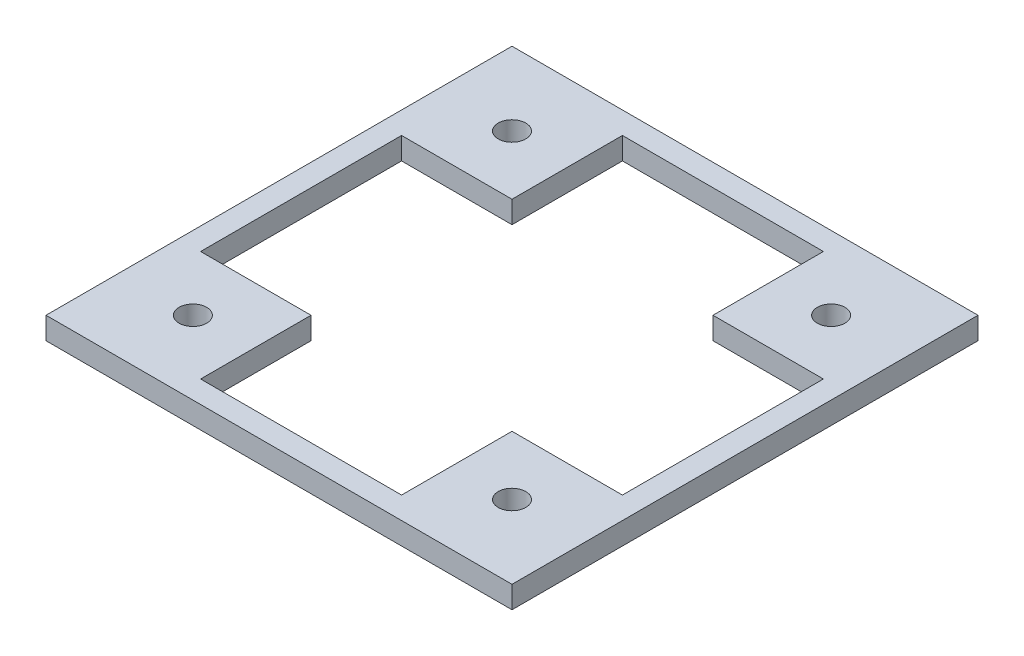
ISO-10303-21;
HEADER;
FILE_DESCRIPTION(('STEP AP214'),'2;1');
FILE_NAME('part.step','',(''),(''),'','','');
FILE_SCHEMA(('AUTOMOTIVE_DESIGN { 1 0 10303 214 1 1 1 1 }'));
ENDSEC;
DATA;
#1=APPLICATION_CONTEXT('core data for automotive mechanical design processes');
#2=APPLICATION_PROTOCOL_DEFINITION('international standard','automotive_design',2000,#1);
#3=PRODUCT_CONTEXT('',#1,'mechanical');
#4=PRODUCT('Part','Part','',(#3));
#5=PRODUCT_RELATED_PRODUCT_CATEGORY('part','',(#4));
#6=PRODUCT_DEFINITION_FORMATION('','',#4);
#7=PRODUCT_DEFINITION_CONTEXT('part definition',#1,'design');
#8=PRODUCT_DEFINITION('design','',#6,#7);
#9=PRODUCT_DEFINITION_SHAPE('','',#8);
#10=(LENGTH_UNIT() NAMED_UNIT(*) SI_UNIT(.MILLI.,.METRE.));
#11=(NAMED_UNIT(*) PLANE_ANGLE_UNIT() SI_UNIT($,.RADIAN.));
#12=(NAMED_UNIT(*) SI_UNIT($,.STERADIAN.) SOLID_ANGLE_UNIT());
#13=UNCERTAINTY_MEASURE_WITH_UNIT(LENGTH_MEASURE(1.E-05),#10,'distance_accuracy_value','');
#14=(GEOMETRIC_REPRESENTATION_CONTEXT(3) GLOBAL_UNCERTAINTY_ASSIGNED_CONTEXT((#13)) GLOBAL_UNIT_ASSIGNED_CONTEXT((#10,
#11,#12)) REPRESENTATION_CONTEXT('',''));
#15=CARTESIAN_POINT('',(0.,0.,0.));
#16=DIRECTION('',(0.,0.,1.));
#17=DIRECTION('',(1.,0.,0.));
#18=AXIS2_PLACEMENT_3D('',#15,#16,#17);
#19=CARTESIAN_POINT('',(-41.925626342507,2.,0.));
#20=DIRECTION('',(1.,0.,0.));
#21=DIRECTION('',(0.,0.,-1.));
#22=AXIS2_PLACEMENT_3D('',#19,#20,#21);
#23=PLANE('',#22);
#24=DIRECTION('',(0.,0.,1.));
#25=VECTOR('',#24,1.);
#26=CARTESIAN_POINT('',(-41.925626342507,0.,0.));
#27=LINE('',#26,#25);
#28=CARTESIAN_POINT('',(-41.925626342507,0.,-55.0108557996784));
#29=VERTEX_POINT('',#28);
#30=CARTESIAN_POINT('',(-41.925626342507,0.,-12.8108557996784));
#31=VERTEX_POINT('',#30);
#32=EDGE_CURVE('E219',#29,#31,#27,.T.);
#33=ORIENTED_EDGE('',*,*,#32,.F.);
#34=DIRECTION('',(0.,-1.,0.));
#35=VECTOR('',#34,1.);
#36=CARTESIAN_POINT('',(-41.925626342507,2.,-55.0108557996784));
#37=LINE('',#36,#35);
#38=CARTESIAN_POINT('',(-41.925626342507,2.,-55.0108557996784));
#39=VERTEX_POINT('',#38);
#40=EDGE_CURVE('E11',#39,#29,#37,.T.);
#41=ORIENTED_EDGE('',*,*,#40,.F.);
#42=DIRECTION('',(0.,0.,1.));
#43=VECTOR('',#42,1.);
#44=CARTESIAN_POINT('',(-41.925626342507,2.,0.));
#45=LINE('',#44,#43);
#46=CARTESIAN_POINT('',(-41.925626342507,2.,-12.8108557996784));
#47=VERTEX_POINT('',#46);
#48=EDGE_CURVE('E177',#39,#47,#45,.T.);
#49=ORIENTED_EDGE('',*,*,#48,.T.);
#50=DIRECTION('',(0.,-1.,0.));
#51=VECTOR('',#50,1.);
#52=CARTESIAN_POINT('',(-41.925626342507,2.,-12.8108557996784));
#53=LINE('',#52,#51);
#54=EDGE_CURVE('E115',#47,#31,#53,.T.);
#55=ORIENTED_EDGE('',*,*,#54,.T.);
#56=EDGE_LOOP('',(#33,#41,#49,#55));
#57=FACE_BOUND('',#56,.T.);
#58=ADVANCED_FACE('F37',(#57),#23,.T.);
#59=CARTESIAN_POINT('',(0.,2.,-55.0108557996784));
#60=DIRECTION('',(0.,0.,-1.));
#61=DIRECTION('',(-1.,0.,0.));
#62=AXIS2_PLACEMENT_3D('',#59,#60,#61);
#63=PLANE('',#62);
#64=DIRECTION('',(1.,0.,0.));
#65=VECTOR('',#64,1.);
#66=CARTESIAN_POINT('',(0.,0.,-55.0108557996784));
#67=LINE('',#66,#65);
#68=CARTESIAN_POINT('',(-84.125626342507,0.,-55.0108557996784));
#69=VERTEX_POINT('',#68);
#70=EDGE_CURVE('E167',#69,#29,#67,.T.);
#71=ORIENTED_EDGE('',*,*,#70,.F.);
#72=DIRECTION('',(0.,-1.,0.));
#73=VECTOR('',#72,1.);
#74=CARTESIAN_POINT('',(-84.125626342507,2.,-55.0108557996784));
#75=LINE('',#74,#73);
#76=CARTESIAN_POINT('',(-84.125626342507,2.,-55.0108557996784));
#77=VERTEX_POINT('',#76);
#78=EDGE_CURVE('E47',#77,#69,#75,.T.);
#79=ORIENTED_EDGE('',*,*,#78,.F.);
#80=DIRECTION('',(1.,0.,0.));
#81=VECTOR('',#80,1.);
#82=CARTESIAN_POINT('',(0.,2.,-55.0108557996784));
#83=LINE('',#82,#81);
#84=EDGE_CURVE('E165',#77,#39,#83,.T.);
#85=ORIENTED_EDGE('',*,*,#84,.T.);
#86=ORIENTED_EDGE('',*,*,#40,.T.);
#87=EDGE_LOOP('',(#71,#79,#85,#86));
#88=FACE_BOUND('',#87,.T.);
#89=ADVANCED_FACE('F163',(#88),#63,.T.);
#90=CARTESIAN_POINT('',(-84.125626342507,2.,0.));
#91=DIRECTION('',(1.,0.,0.));
#92=DIRECTION('',(0.,0.,-1.));
#93=AXIS2_PLACEMENT_3D('',#90,#91,#92);
#94=PLANE('',#93);
#95=DIRECTION('',(0.,0.,1.));
#96=VECTOR('',#95,1.);
#97=CARTESIAN_POINT('',(-84.125626342507,0.,0.));
#98=LINE('',#97,#96);
#99=CARTESIAN_POINT('',(-84.125626342507,0.,-12.8108557996784));
#100=VERTEX_POINT('',#99);
#101=EDGE_CURVE('E222',#69,#100,#98,.T.);
#102=ORIENTED_EDGE('',*,*,#101,.T.);
#103=DIRECTION('',(0.,-1.,0.));
#104=VECTOR('',#103,1.);
#105=CARTESIAN_POINT('',(-84.125626342507,2.,-12.8108557996784));
#106=LINE('',#105,#104);
#107=CARTESIAN_POINT('',(-84.125626342507,2.,-12.8108557996784));
#108=VERTEX_POINT('',#107);
#109=EDGE_CURVE('E170',#108,#100,#106,.T.);
#110=ORIENTED_EDGE('',*,*,#109,.F.);
#111=DIRECTION('',(0.,0.,1.));
#112=VECTOR('',#111,1.);
#113=CARTESIAN_POINT('',(-84.125626342507,2.,0.));
#114=LINE('',#113,#112);
#115=EDGE_CURVE('E173',#77,#108,#114,.T.);
#116=ORIENTED_EDGE('',*,*,#115,.F.);
#117=ORIENTED_EDGE('',*,*,#78,.T.);
#118=EDGE_LOOP('',(#102,#110,#116,#117));
#119=FACE_BOUND('',#118,.T.);
#120=ADVANCED_FACE('F174',(#119),#94,.F.);
#121=CARTESIAN_POINT('',(-72.125626342507,2.,0.));
#122=DIRECTION('',(1.,0.,0.));
#123=DIRECTION('',(0.,0.,-1.));
#124=AXIS2_PLACEMENT_3D('',#121,#122,#123);
#125=PLANE('',#124);
#126=DIRECTION('',(0.,0.,1.));
#127=VECTOR('',#126,1.);
#128=CARTESIAN_POINT('',(-72.125626342507,0.,0.));
#129=LINE('',#128,#127);
#130=CARTESIAN_POINT('',(-72.125626342507,0.,-53.0108557996784));
#131=VERTEX_POINT('',#130);
#132=CARTESIAN_POINT('',(-72.125626342507,0.,-43.0108557996784));
#133=VERTEX_POINT('',#132);
#134=EDGE_CURVE('E185',#131,#133,#129,.T.);
#135=ORIENTED_EDGE('',*,*,#134,.F.);
#136=DIRECTION('',(0.,-1.,0.));
#137=VECTOR('',#136,1.);
#138=CARTESIAN_POINT('',(-72.125626342507,2.,-53.0108557996784));
#139=LINE('',#138,#137);
#140=CARTESIAN_POINT('',(-72.125626342507,2.,-53.0108557996784));
#141=VERTEX_POINT('',#140);
#142=EDGE_CURVE('E41',#141,#131,#139,.T.);
#143=ORIENTED_EDGE('',*,*,#142,.F.);
#144=DIRECTION('',(0.,0.,1.));
#145=VECTOR('',#144,1.);
#146=CARTESIAN_POINT('',(-72.125626342507,2.,0.));
#147=LINE('',#146,#145);
#148=CARTESIAN_POINT('',(-72.125626342507,2.,-43.0108557996784));
#149=VERTEX_POINT('',#148);
#150=EDGE_CURVE('E225',#141,#149,#147,.T.);
#151=ORIENTED_EDGE('',*,*,#150,.T.);
#152=DIRECTION('',(0.,-1.,0.));
#153=VECTOR('',#152,1.);
#154=CARTESIAN_POINT('',(-72.125626342507,2.,-43.0108557996784));
#155=LINE('',#154,#153);
#156=EDGE_CURVE('E184',#149,#133,#155,.T.);
#157=ORIENTED_EDGE('',*,*,#156,.T.);
#158=EDGE_LOOP('',(#135,#143,#151,#157));
#159=FACE_BOUND('',#158,.T.);
#160=ADVANCED_FACE('F39',(#159),#125,.T.);
#161=CARTESIAN_POINT('',(0.,2.,-53.0108557996784));
#162=DIRECTION('',(0.,0.,-1.));
#163=DIRECTION('',(-1.,0.,0.));
#164=AXIS2_PLACEMENT_3D('',#161,#162,#163);
#165=PLANE('',#164);
#166=DIRECTION('',(1.,0.,0.));
#167=VECTOR('',#166,1.);
#168=CARTESIAN_POINT('',(0.,0.,-53.0108557996784));
#169=LINE('',#168,#167);
#170=CARTESIAN_POINT('',(-53.925626342507,0.,-53.0108557996784));
#171=VERTEX_POINT('',#170);
#172=EDGE_CURVE('E188',#131,#171,#169,.T.);
#173=ORIENTED_EDGE('',*,*,#172,.T.);
#174=DIRECTION('',(0.,-1.,0.));
#175=VECTOR('',#174,1.);
#176=CARTESIAN_POINT('',(-53.925626342507,2.,-53.0108557996784));
#177=LINE('',#176,#175);
#178=CARTESIAN_POINT('',(-53.925626342507,2.,-53.0108557996784));
#179=VERTEX_POINT('',#178);
#180=EDGE_CURVE('E248',#179,#171,#177,.T.);
#181=ORIENTED_EDGE('',*,*,#180,.F.);
#182=DIRECTION('',(1.,0.,0.));
#183=VECTOR('',#182,1.);
#184=CARTESIAN_POINT('',(0.,2.,-53.0108557996784));
#185=LINE('',#184,#183);
#186=EDGE_CURVE('E257',#141,#179,#185,.T.);
#187=ORIENTED_EDGE('',*,*,#186,.F.);
#188=ORIENTED_EDGE('',*,*,#142,.T.);
#189=EDGE_LOOP('',(#173,#181,#187,#188));
#190=FACE_BOUND('',#189,.T.);
#191=ADVANCED_FACE('F256',(#190),#165,.F.);
#192=CARTESIAN_POINT('',(-53.925626342507,2.,0.));
#193=DIRECTION('',(1.,0.,0.));
#194=DIRECTION('',(0.,0.,-1.));
#195=AXIS2_PLACEMENT_3D('',#192,#193,#194);
#196=PLANE('',#195);
#197=DIRECTION('',(0.,0.,1.));
#198=VECTOR('',#197,1.);
#199=CARTESIAN_POINT('',(-53.925626342507,0.,0.));
#200=LINE('',#199,#198);
#201=CARTESIAN_POINT('',(-53.925626342507,0.,-43.0108557996785));
#202=VERTEX_POINT('',#201);
#203=EDGE_CURVE('E191',#171,#202,#200,.T.);
#204=ORIENTED_EDGE('',*,*,#203,.T.);
#205=DIRECTION('',(0.,-1.,0.));
#206=VECTOR('',#205,1.);
#207=CARTESIAN_POINT('',(-53.925626342507,2.,-43.0108557996785));
#208=LINE('',#207,#206);
#209=CARTESIAN_POINT('',(-53.925626342507,2.,-43.0108557996785));
#210=VERTEX_POINT('',#209);
#211=EDGE_CURVE('E246',#210,#202,#208,.T.);
#212=ORIENTED_EDGE('',*,*,#211,.F.);
#213=DIRECTION('',(0.,0.,1.));
#214=VECTOR('',#213,1.);
#215=CARTESIAN_POINT('',(-53.925626342507,2.,0.));
#216=LINE('',#215,#214);
#217=EDGE_CURVE('E313',#179,#210,#216,.T.);
#218=ORIENTED_EDGE('',*,*,#217,.F.);
#219=ORIENTED_EDGE('',*,*,#180,.T.);
#220=EDGE_LOOP('',(#204,#212,#218,#219));
#221=FACE_BOUND('',#220,.T.);
#222=ADVANCED_FACE('F312',(#221),#196,.F.);
#223=CARTESIAN_POINT('',(0.,2.,-43.0108557996785));
#224=DIRECTION('',(0.,0.,-1.));
#225=DIRECTION('',(-1.,0.,0.));
#226=AXIS2_PLACEMENT_3D('',#223,#224,#225);
#227=PLANE('',#226);
#228=DIRECTION('',(1.,0.,0.));
#229=VECTOR('',#228,1.);
#230=CARTESIAN_POINT('',(0.,0.,-43.0108557996785));
#231=LINE('',#230,#229);
#232=CARTESIAN_POINT('',(-43.925626342507,0.,-43.0108557996785));
#233=VERTEX_POINT('',#232);
#234=EDGE_CURVE('E193',#202,#233,#231,.T.);
#235=ORIENTED_EDGE('',*,*,#234,.T.);
#236=DIRECTION('',(0.,-1.,0.));
#237=VECTOR('',#236,1.);
#238=CARTESIAN_POINT('',(-43.925626342507,2.,-43.0108557996785));
#239=LINE('',#238,#237);
#240=CARTESIAN_POINT('',(-43.925626342507,2.,-43.0108557996785));
#241=VERTEX_POINT('',#240);
#242=EDGE_CURVE('E243',#241,#233,#239,.T.);
#243=ORIENTED_EDGE('',*,*,#242,.F.);
#244=DIRECTION('',(1.,0.,0.));
#245=VECTOR('',#244,1.);
#246=CARTESIAN_POINT('',(0.,2.,-43.0108557996785));
#247=LINE('',#246,#245);
#248=EDGE_CURVE('E311',#210,#241,#247,.T.);
#249=ORIENTED_EDGE('',*,*,#248,.F.);
#250=ORIENTED_EDGE('',*,*,#211,.T.);
#251=EDGE_LOOP('',(#235,#243,#249,#250));
#252=FACE_BOUND('',#251,.T.);
#253=ADVANCED_FACE('F308',(#252),#227,.F.);
#254=CARTESIAN_POINT('',(-43.925626342507,2.,0.));
#255=DIRECTION('',(1.,0.,0.));
#256=DIRECTION('',(0.,0.,-1.));
#257=AXIS2_PLACEMENT_3D('',#254,#255,#256);
#258=PLANE('',#257);
#259=DIRECTION('',(0.,0.,1.));
#260=VECTOR('',#259,1.);
#261=CARTESIAN_POINT('',(-43.925626342507,0.,0.));
#262=LINE('',#261,#260);
#263=CARTESIAN_POINT('',(-43.925626342507,0.,-24.8108557996784));
#264=VERTEX_POINT('',#263);
#265=EDGE_CURVE('E195',#233,#264,#262,.T.);
#266=ORIENTED_EDGE('',*,*,#265,.T.);
#267=DIRECTION('',(0.,-1.,0.));
#268=VECTOR('',#267,1.);
#269=CARTESIAN_POINT('',(-43.925626342507,2.,-24.8108557996784));
#270=LINE('',#269,#268);
#271=CARTESIAN_POINT('',(-43.925626342507,2.,-24.8108557996784));
#272=VERTEX_POINT('',#271);
#273=EDGE_CURVE('E241',#272,#264,#270,.T.);
#274=ORIENTED_EDGE('',*,*,#273,.F.);
#275=DIRECTION('',(0.,0.,1.));
#276=VECTOR('',#275,1.);
#277=CARTESIAN_POINT('',(-43.925626342507,2.,0.));
#278=LINE('',#277,#276);
#279=EDGE_CURVE('E316',#241,#272,#278,.T.);
#280=ORIENTED_EDGE('',*,*,#279,.F.);
#281=ORIENTED_EDGE('',*,*,#242,.T.);
#282=EDGE_LOOP('',(#266,#274,#280,#281));
#283=FACE_BOUND('',#282,.T.);
#284=ADVANCED_FACE('F305',(#283),#258,.F.);
#285=CARTESIAN_POINT('',(0.,2.,-24.8108557996784));
#286=DIRECTION('',(0.,0.,-1.));
#287=DIRECTION('',(-1.,0.,0.));
#288=AXIS2_PLACEMENT_3D('',#285,#286,#287);
#289=PLANE('',#288);
#290=DIRECTION('',(1.,0.,0.));
#291=VECTOR('',#290,1.);
#292=CARTESIAN_POINT('',(0.,0.,-24.8108557996784));
#293=LINE('',#292,#291);
#294=CARTESIAN_POINT('',(-53.925626342507,0.,-24.8108557996784));
#295=VERTEX_POINT('',#294);
#296=EDGE_CURVE('E198',#295,#264,#293,.T.);
#297=ORIENTED_EDGE('',*,*,#296,.F.);
#298=DIRECTION('',(0.,-1.,0.));
#299=VECTOR('',#298,1.);
#300=CARTESIAN_POINT('',(-53.925626342507,2.,-24.8108557996784));
#301=LINE('',#300,#299);
#302=CARTESIAN_POINT('',(-53.925626342507,2.,-24.8108557996784));
#303=VERTEX_POINT('',#302);
#304=EDGE_CURVE('E239',#303,#295,#301,.T.);
#305=ORIENTED_EDGE('',*,*,#304,.F.);
#306=DIRECTION('',(1.,0.,0.));
#307=VECTOR('',#306,1.);
#308=CARTESIAN_POINT('',(0.,2.,-24.8108557996784));
#309=LINE('',#308,#307);
#310=EDGE_CURVE('E302',#303,#272,#309,.T.);
#311=ORIENTED_EDGE('',*,*,#310,.T.);
#312=ORIENTED_EDGE('',*,*,#273,.T.);
#313=EDGE_LOOP('',(#297,#305,#311,#312));
#314=FACE_BOUND('',#313,.T.);
#315=ADVANCED_FACE('F298',(#314),#289,.T.);
#316=CARTESIAN_POINT('',(-53.925626342507,2.,0.));
#317=DIRECTION('',(1.,0.,0.));
#318=DIRECTION('',(0.,0.,-1.));
#319=AXIS2_PLACEMENT_3D('',#316,#317,#318);
#320=PLANE('',#319);
#321=DIRECTION('',(0.,0.,1.));
#322=VECTOR('',#321,1.);
#323=CARTESIAN_POINT('',(-53.925626342507,0.,0.));
#324=LINE('',#323,#322);
#325=CARTESIAN_POINT('',(-53.925626342507,0.,-14.8108557996784));
#326=VERTEX_POINT('',#325);
#327=EDGE_CURVE('E201',#295,#326,#324,.T.);
#328=ORIENTED_EDGE('',*,*,#327,.T.);
#329=DIRECTION('',(0.,-1.,0.));
#330=VECTOR('',#329,1.);
#331=CARTESIAN_POINT('',(-53.925626342507,2.,-14.8108557996784));
#332=LINE('',#331,#330);
#333=CARTESIAN_POINT('',(-53.925626342507,2.,-14.8108557996784));
#334=VERTEX_POINT('',#333);
#335=EDGE_CURVE('E237',#334,#326,#332,.T.);
#336=ORIENTED_EDGE('',*,*,#335,.F.);
#337=DIRECTION('',(0.,0.,1.));
#338=VECTOR('',#337,1.);
#339=CARTESIAN_POINT('',(-53.925626342507,2.,0.));
#340=LINE('',#339,#338);
#341=EDGE_CURVE('E323',#303,#334,#340,.T.);
#342=ORIENTED_EDGE('',*,*,#341,.F.);
#343=ORIENTED_EDGE('',*,*,#304,.T.);
#344=EDGE_LOOP('',(#328,#336,#342,#343));
#345=FACE_BOUND('',#344,.T.);
#346=ADVANCED_FACE('F294',(#345),#320,.F.);
#347=CARTESIAN_POINT('',(0.,2.,-14.8108557996784));
#348=DIRECTION('',(0.,0.,-1.));
#349=DIRECTION('',(-1.,0.,0.));
#350=AXIS2_PLACEMENT_3D('',#347,#348,#349);
#351=PLANE('',#350);
#352=DIRECTION('',(1.,0.,0.));
#353=VECTOR('',#352,1.);
#354=CARTESIAN_POINT('',(0.,0.,-14.8108557996784));
#355=LINE('',#354,#353);
#356=CARTESIAN_POINT('',(-72.125626342507,0.,-14.8108557996784));
#357=VERTEX_POINT('',#356);
#358=EDGE_CURVE('E204',#357,#326,#355,.T.);
#359=ORIENTED_EDGE('',*,*,#358,.F.);
#360=DIRECTION('',(0.,-1.,0.));
#361=VECTOR('',#360,1.);
#362=CARTESIAN_POINT('',(-72.125626342507,2.,-14.8108557996784));
#363=LINE('',#362,#361);
#364=CARTESIAN_POINT('',(-72.125626342507,2.,-14.8108557996784));
#365=VERTEX_POINT('',#364);
#366=EDGE_CURVE('E235',#365,#357,#363,.T.);
#367=ORIENTED_EDGE('',*,*,#366,.F.);
#368=DIRECTION('',(1.,0.,0.));
#369=VECTOR('',#368,1.);
#370=CARTESIAN_POINT('',(0.,2.,-14.8108557996784));
#371=LINE('',#370,#369);
#372=EDGE_CURVE('E291',#365,#334,#371,.T.);
#373=ORIENTED_EDGE('',*,*,#372,.T.);
#374=ORIENTED_EDGE('',*,*,#335,.T.);
#375=EDGE_LOOP('',(#359,#367,#373,#374));
#376=FACE_BOUND('',#375,.T.);
#377=ADVANCED_FACE('F289',(#376),#351,.T.);
#378=CARTESIAN_POINT('',(-72.125626342507,2.,0.));
#379=DIRECTION('',(1.,0.,0.));
#380=DIRECTION('',(0.,0.,-1.));
#381=AXIS2_PLACEMENT_3D('',#378,#379,#380);
#382=PLANE('',#381);
#383=DIRECTION('',(0.,0.,1.));
#384=VECTOR('',#383,1.);
#385=CARTESIAN_POINT('',(-72.125626342507,0.,0.));
#386=LINE('',#385,#384);
#387=CARTESIAN_POINT('',(-72.125626342507,0.,-24.8108557996784));
#388=VERTEX_POINT('',#387);
#389=EDGE_CURVE('E207',#388,#357,#386,.T.);
#390=ORIENTED_EDGE('',*,*,#389,.F.);
#391=DIRECTION('',(0.,-1.,0.));
#392=VECTOR('',#391,1.);
#393=CARTESIAN_POINT('',(-72.125626342507,2.,-24.8108557996784));
#394=LINE('',#393,#392);
#395=CARTESIAN_POINT('',(-72.125626342507,2.,-24.8108557996784));
#396=VERTEX_POINT('',#395);
#397=EDGE_CURVE('E233',#396,#388,#394,.T.);
#398=ORIENTED_EDGE('',*,*,#397,.F.);
#399=DIRECTION('',(0.,0.,1.));
#400=VECTOR('',#399,1.);
#401=CARTESIAN_POINT('',(-72.125626342507,2.,0.));
#402=LINE('',#401,#400);
#403=EDGE_CURVE('E285',#396,#365,#402,.T.);
#404=ORIENTED_EDGE('',*,*,#403,.T.);
#405=ORIENTED_EDGE('',*,*,#366,.T.);
#406=EDGE_LOOP('',(#390,#398,#404,#405));
#407=FACE_BOUND('',#406,.T.);
#408=ADVANCED_FACE('F282',(#407),#382,.T.);
#409=CARTESIAN_POINT('',(0.,2.,-24.8108557996784));
#410=DIRECTION('',(0.,0.,-1.));
#411=DIRECTION('',(-1.,0.,0.));
#412=AXIS2_PLACEMENT_3D('',#409,#410,#411);
#413=PLANE('',#412);
#414=DIRECTION('',(1.,0.,0.));
#415=VECTOR('',#414,1.);
#416=CARTESIAN_POINT('',(0.,0.,-24.8108557996784));
#417=LINE('',#416,#415);
#418=CARTESIAN_POINT('',(-82.125626342507,0.,-24.8108557996784));
#419=VERTEX_POINT('',#418);
#420=EDGE_CURVE('E210',#419,#388,#417,.T.);
#421=ORIENTED_EDGE('',*,*,#420,.F.);
#422=DIRECTION('',(0.,-1.,0.));
#423=VECTOR('',#422,1.);
#424=CARTESIAN_POINT('',(-82.125626342507,2.,-24.8108557996784));
#425=LINE('',#424,#423);
#426=CARTESIAN_POINT('',(-82.125626342507,2.,-24.8108557996784));
#427=VERTEX_POINT('',#426);
#428=EDGE_CURVE('E231',#427,#419,#425,.T.);
#429=ORIENTED_EDGE('',*,*,#428,.F.);
#430=DIRECTION('',(1.,0.,0.));
#431=VECTOR('',#430,1.);
#432=CARTESIAN_POINT('',(0.,2.,-24.8108557996784));
#433=LINE('',#432,#431);
#434=EDGE_CURVE('E327',#427,#396,#433,.T.);
#435=ORIENTED_EDGE('',*,*,#434,.T.);
#436=ORIENTED_EDGE('',*,*,#397,.T.);
#437=EDGE_LOOP('',(#421,#429,#435,#436));
#438=FACE_BOUND('',#437,.T.);
#439=ADVANCED_FACE('F277',(#438),#413,.T.);
#440=CARTESIAN_POINT('',(-82.125626342507,2.,0.));
#441=DIRECTION('',(1.,0.,0.));
#442=DIRECTION('',(0.,0.,-1.));
#443=AXIS2_PLACEMENT_3D('',#440,#441,#442);
#444=PLANE('',#443);
#445=DIRECTION('',(0.,0.,1.));
#446=VECTOR('',#445,1.);
#447=CARTESIAN_POINT('',(-82.125626342507,0.,0.));
#448=LINE('',#447,#446);
#449=CARTESIAN_POINT('',(-82.125626342507,0.,-43.0108557996784));
#450=VERTEX_POINT('',#449);
#451=EDGE_CURVE('E213',#450,#419,#448,.T.);
#452=ORIENTED_EDGE('',*,*,#451,.F.);
#453=DIRECTION('',(0.,-1.,0.));
#454=VECTOR('',#453,1.);
#455=CARTESIAN_POINT('',(-82.125626342507,2.,-43.0108557996784));
#456=LINE('',#455,#454);
#457=CARTESIAN_POINT('',(-82.125626342507,2.,-43.0108557996784));
#458=VERTEX_POINT('',#457);
#459=EDGE_CURVE('E229',#458,#450,#456,.T.);
#460=ORIENTED_EDGE('',*,*,#459,.F.);
#461=DIRECTION('',(0.,0.,1.));
#462=VECTOR('',#461,1.);
#463=CARTESIAN_POINT('',(-82.125626342507,2.,0.));
#464=LINE('',#463,#462);
#465=EDGE_CURVE('E273',#458,#427,#464,.T.);
#466=ORIENTED_EDGE('',*,*,#465,.T.);
#467=ORIENTED_EDGE('',*,*,#428,.T.);
#468=EDGE_LOOP('',(#452,#460,#466,#467));
#469=FACE_BOUND('',#468,.T.);
#470=ADVANCED_FACE('F269',(#469),#444,.T.);
#471=CARTESIAN_POINT('',(0.,2.,-43.0108557996785));
#472=DIRECTION('',(0.,0.,-1.));
#473=DIRECTION('',(-1.,0.,0.));
#474=AXIS2_PLACEMENT_3D('',#471,#472,#473);
#475=PLANE('',#474);
#476=DIRECTION('',(1.,0.,0.));
#477=VECTOR('',#476,1.);
#478=CARTESIAN_POINT('',(0.,0.,-43.0108557996785));
#479=LINE('',#478,#477);
#480=EDGE_CURVE('E216',#450,#133,#479,.T.);
#481=ORIENTED_EDGE('',*,*,#480,.T.);
#482=ORIENTED_EDGE('',*,*,#156,.F.);
#483=DIRECTION('',(1.,0.,0.));
#484=VECTOR('',#483,1.);
#485=CARTESIAN_POINT('',(0.,2.,-43.0108557996785));
#486=LINE('',#485,#484);
#487=EDGE_CURVE('E179',#458,#149,#486,.T.);
#488=ORIENTED_EDGE('',*,*,#487,.F.);
#489=ORIENTED_EDGE('',*,*,#459,.T.);
#490=EDGE_LOOP('',(#481,#482,#488,#489));
#491=FACE_BOUND('',#490,.T.);
#492=ADVANCED_FACE('F266',(#491),#475,.F.);
#493=CARTESIAN_POINT('',(0.,2.,-12.8108557996784));
#494=DIRECTION('',(0.,0.,-1.));
#495=DIRECTION('',(-1.,0.,0.));
#496=AXIS2_PLACEMENT_3D('',#493,#494,#495);
#497=PLANE('',#496);
#498=DIRECTION('',(1.,0.,0.));
#499=VECTOR('',#498,1.);
#500=CARTESIAN_POINT('',(0.,0.,-12.8108557996784));
#501=LINE('',#500,#499);
#502=EDGE_CURVE('E108',#100,#31,#501,.T.);
#503=ORIENTED_EDGE('',*,*,#502,.T.);
#504=ORIENTED_EDGE('',*,*,#54,.F.);
#505=DIRECTION('',(1.,0.,0.));
#506=VECTOR('',#505,1.);
#507=CARTESIAN_POINT('',(0.,2.,-12.8108557996784));
#508=LINE('',#507,#506);
#509=EDGE_CURVE('E56',#108,#47,#508,.T.);
#510=ORIENTED_EDGE('',*,*,#509,.F.);
#511=ORIENTED_EDGE('',*,*,#109,.T.);
#512=EDGE_LOOP('',(#503,#504,#510,#511));
#513=FACE_BOUND('',#512,.T.);
#514=ADVANCED_FACE('F358',(#513),#497,.F.);
#515=CARTESIAN_POINT('',(0.,2.,0.));
#516=DIRECTION('',(0.,1.,0.));
#517=DIRECTION('',(0.,0.,1.));
#518=AXIS2_PLACEMENT_3D('',#515,#516,#517);
#519=PLANE('',#518);
#520=CARTESIAN_POINT('',(-77.475626342507,2.,-48.3608557996784));
#521=DIRECTION('',(0.,1.,0.));
#522=DIRECTION('',(0.,0.,1.));
#523=AXIS2_PLACEMENT_3D('',#520,#521,#522);
#524=CIRCLE('',#523,1.25);
#525=CARTESIAN_POINT('',(-77.475626342507,2.,-47.1108557996784));
#526=VERTEX_POINT('',#525);
#527=EDGE_CURVE('E350',#526,#526,#524,.T.);
#528=ORIENTED_EDGE('',*,*,#527,.F.);
#529=EDGE_LOOP('',(#528));
#530=FACE_BOUND('',#529,.T.);
#531=CARTESIAN_POINT('',(-48.575626342507,2.,-48.3608557996784));
#532=DIRECTION('',(0.,1.,0.));
#533=DIRECTION('',(0.,0.,1.));
#534=AXIS2_PLACEMENT_3D('',#531,#532,#533);
#535=CIRCLE('',#534,1.25);
#536=CARTESIAN_POINT('',(-48.575626342507,2.,-47.1108557996784));
#537=VERTEX_POINT('',#536);
#538=EDGE_CURVE('E344',#537,#537,#535,.T.);
#539=ORIENTED_EDGE('',*,*,#538,.F.);
#540=EDGE_LOOP('',(#539));
#541=FACE_BOUND('',#540,.T.);
#542=CARTESIAN_POINT('',(-48.575626342507,2.,-19.4608557996784));
#543=DIRECTION('',(0.,1.,0.));
#544=DIRECTION('',(0.,0.,1.));
#545=AXIS2_PLACEMENT_3D('',#542,#543,#544);
#546=CIRCLE('',#545,1.25);
#547=CARTESIAN_POINT('',(-48.575626342507,2.,-18.2108557996784));
#548=VERTEX_POINT('',#547);
#549=EDGE_CURVE('E338',#548,#548,#546,.T.);
#550=ORIENTED_EDGE('',*,*,#549,.F.);
#551=EDGE_LOOP('',(#550));
#552=FACE_BOUND('',#551,.T.);
#553=CARTESIAN_POINT('',(-77.475626342507,2.,-19.4608557996784));
#554=DIRECTION('',(0.,1.,0.));
#555=DIRECTION('',(0.,0.,1.));
#556=AXIS2_PLACEMENT_3D('',#553,#554,#555);
#557=CIRCLE('',#556,1.25);
#558=CARTESIAN_POINT('',(-77.475626342507,2.,-18.2108557996784));
#559=VERTEX_POINT('',#558);
#560=EDGE_CURVE('E332',#559,#559,#557,.T.);
#561=ORIENTED_EDGE('',*,*,#560,.F.);
#562=EDGE_LOOP('',(#561));
#563=FACE_BOUND('',#562,.T.);
#564=ORIENTED_EDGE('',*,*,#150,.F.);
#565=ORIENTED_EDGE('',*,*,#186,.T.);
#566=ORIENTED_EDGE('',*,*,#217,.T.);
#567=ORIENTED_EDGE('',*,*,#248,.T.);
#568=ORIENTED_EDGE('',*,*,#279,.T.);
#569=ORIENTED_EDGE('',*,*,#310,.F.);
#570=ORIENTED_EDGE('',*,*,#341,.T.);
#571=ORIENTED_EDGE('',*,*,#372,.F.);
#572=ORIENTED_EDGE('',*,*,#403,.F.);
#573=ORIENTED_EDGE('',*,*,#434,.F.);
#574=ORIENTED_EDGE('',*,*,#465,.F.);
#575=ORIENTED_EDGE('',*,*,#487,.T.);
#576=EDGE_LOOP('',(#564,#565,#566,#567,#568,#569,#570,#571,#572,#573,#574,#575));
#577=FACE_BOUND('',#576,.T.);
#578=ORIENTED_EDGE('',*,*,#48,.F.);
#579=ORIENTED_EDGE('',*,*,#84,.F.);
#580=ORIENTED_EDGE('',*,*,#115,.T.);
#581=ORIENTED_EDGE('',*,*,#509,.T.);
#582=EDGE_LOOP('',(#578,#579,#580,#581));
#583=FACE_BOUND('',#582,.T.);
#584=ADVANCED_FACE('F176',(#530,#541,#552,#563,#577,#583),#519,.T.);
#585=CARTESIAN_POINT('',(0.,0.,0.));
#586=DIRECTION('',(0.,1.,0.));
#587=DIRECTION('',(0.,0.,1.));
#588=AXIS2_PLACEMENT_3D('',#585,#586,#587);
#589=PLANE('',#588);
#590=CARTESIAN_POINT('',(-77.475626342507,0.,-48.3608557996784));
#591=DIRECTION('',(0.,1.,0.));
#592=DIRECTION('',(0.,0.,1.));
#593=AXIS2_PLACEMENT_3D('',#590,#591,#592);
#594=CIRCLE('',#593,1.25);
#595=CARTESIAN_POINT('',(-77.475626342507,0.,-47.1108557996784));
#596=VERTEX_POINT('',#595);
#597=EDGE_CURVE('E347',#596,#596,#594,.T.);
#598=ORIENTED_EDGE('',*,*,#597,.T.);
#599=EDGE_LOOP('',(#598));
#600=FACE_BOUND('',#599,.T.);
#601=CARTESIAN_POINT('',(-48.575626342507,0.,-48.3608557996784));
#602=DIRECTION('',(0.,1.,0.));
#603=DIRECTION('',(0.,0.,1.));
#604=AXIS2_PLACEMENT_3D('',#601,#602,#603);
#605=CIRCLE('',#604,1.25);
#606=CARTESIAN_POINT('',(-48.575626342507,0.,-47.1108557996784));
#607=VERTEX_POINT('',#606);
#608=EDGE_CURVE('E341',#607,#607,#605,.T.);
#609=ORIENTED_EDGE('',*,*,#608,.T.);
#610=EDGE_LOOP('',(#609));
#611=FACE_BOUND('',#610,.T.);
#612=CARTESIAN_POINT('',(-48.575626342507,0.,-19.4608557996784));
#613=DIRECTION('',(0.,1.,0.));
#614=DIRECTION('',(0.,0.,1.));
#615=AXIS2_PLACEMENT_3D('',#612,#613,#614);
#616=CIRCLE('',#615,1.25);
#617=CARTESIAN_POINT('',(-48.575626342507,0.,-18.2108557996784));
#618=VERTEX_POINT('',#617);
#619=EDGE_CURVE('E335',#618,#618,#616,.T.);
#620=ORIENTED_EDGE('',*,*,#619,.T.);
#621=EDGE_LOOP('',(#620));
#622=FACE_BOUND('',#621,.T.);
#623=CARTESIAN_POINT('',(-77.475626342507,0.,-19.4608557996784));
#624=DIRECTION('',(0.,1.,0.));
#625=DIRECTION('',(0.,0.,1.));
#626=AXIS2_PLACEMENT_3D('',#623,#624,#625);
#627=CIRCLE('',#626,1.25);
#628=CARTESIAN_POINT('',(-77.475626342507,0.,-18.2108557996784));
#629=VERTEX_POINT('',#628);
#630=EDGE_CURVE('E189',#629,#629,#627,.T.);
#631=ORIENTED_EDGE('',*,*,#630,.T.);
#632=EDGE_LOOP('',(#631));
#633=FACE_BOUND('',#632,.T.);
#634=ORIENTED_EDGE('',*,*,#134,.T.);
#635=ORIENTED_EDGE('',*,*,#480,.F.);
#636=ORIENTED_EDGE('',*,*,#451,.T.);
#637=ORIENTED_EDGE('',*,*,#420,.T.);
#638=ORIENTED_EDGE('',*,*,#389,.T.);
#639=ORIENTED_EDGE('',*,*,#358,.T.);
#640=ORIENTED_EDGE('',*,*,#327,.F.);
#641=ORIENTED_EDGE('',*,*,#296,.T.);
#642=ORIENTED_EDGE('',*,*,#265,.F.);
#643=ORIENTED_EDGE('',*,*,#234,.F.);
#644=ORIENTED_EDGE('',*,*,#203,.F.);
#645=ORIENTED_EDGE('',*,*,#172,.F.);
#646=EDGE_LOOP('',(#634,#635,#636,#637,#638,#639,#640,#641,#642,#643,#644,#645));
#647=FACE_BOUND('',#646,.T.);
#648=ORIENTED_EDGE('',*,*,#32,.T.);
#649=ORIENTED_EDGE('',*,*,#502,.F.);
#650=ORIENTED_EDGE('',*,*,#101,.F.);
#651=ORIENTED_EDGE('',*,*,#70,.T.);
#652=EDGE_LOOP('',(#648,#649,#650,#651));
#653=FACE_BOUND('',#652,.T.);
#654=ADVANCED_FACE('F260',(#600,#611,#622,#633,#647,#653),#589,.F.);
#655=CARTESIAN_POINT('',(-77.475626342507,2.,-19.4608557996784));
#656=DIRECTION('',(0.,1.,0.));
#657=DIRECTION('',(0.,0.,1.));
#658=AXIS2_PLACEMENT_3D('',#655,#656,#657);
#659=CYLINDRICAL_SURFACE('',#658,1.25);
#660=ORIENTED_EDGE('',*,*,#630,.F.);
#661=EDGE_LOOP('',(#660));
#662=FACE_BOUND('',#661,.T.);
#663=ORIENTED_EDGE('',*,*,#560,.T.);
#664=EDGE_LOOP('',(#663));
#665=FACE_BOUND('',#664,.T.);
#666=ADVANCED_FACE('F366',(#662,#665),#659,.F.);
#667=CARTESIAN_POINT('',(-48.575626342507,2.,-19.4608557996784));
#668=DIRECTION('',(0.,1.,0.));
#669=DIRECTION('',(0.,0.,1.));
#670=AXIS2_PLACEMENT_3D('',#667,#668,#669);
#671=CYLINDRICAL_SURFACE('',#670,1.25);
#672=ORIENTED_EDGE('',*,*,#619,.F.);
#673=EDGE_LOOP('',(#672));
#674=FACE_BOUND('',#673,.T.);
#675=ORIENTED_EDGE('',*,*,#549,.T.);
#676=EDGE_LOOP('',(#675));
#677=FACE_BOUND('',#676,.T.);
#678=ADVANCED_FACE('F368',(#674,#677),#671,.F.);
#679=CARTESIAN_POINT('',(-48.575626342507,2.,-48.3608557996784));
#680=DIRECTION('',(0.,1.,0.));
#681=DIRECTION('',(0.,0.,1.));
#682=AXIS2_PLACEMENT_3D('',#679,#680,#681);
#683=CYLINDRICAL_SURFACE('',#682,1.25);
#684=ORIENTED_EDGE('',*,*,#608,.F.);
#685=EDGE_LOOP('',(#684));
#686=FACE_BOUND('',#685,.T.);
#687=ORIENTED_EDGE('',*,*,#538,.T.);
#688=EDGE_LOOP('',(#687));
#689=FACE_BOUND('',#688,.T.);
#690=ADVANCED_FACE('F375',(#686,#689),#683,.F.);
#691=CARTESIAN_POINT('',(-77.475626342507,2.,-48.3608557996784));
#692=DIRECTION('',(0.,1.,0.));
#693=DIRECTION('',(0.,0.,1.));
#694=AXIS2_PLACEMENT_3D('',#691,#692,#693);
#695=CYLINDRICAL_SURFACE('',#694,1.25);
#696=ORIENTED_EDGE('',*,*,#597,.F.);
#697=EDGE_LOOP('',(#696));
#698=FACE_BOUND('',#697,.T.);
#699=ORIENTED_EDGE('',*,*,#527,.T.);
#700=EDGE_LOOP('',(#699));
#701=FACE_BOUND('',#700,.T.);
#702=ADVANCED_FACE('F354',(#698,#701),#695,.F.);
#703=CLOSED_SHELL('',(#58,#89,#120,#160,#191,#222,#253,#284,#315,#346,#377,#408,#439,#470,#492,
#514,#584,#654,#666,#678,#690,#702));
#704=MANIFOLD_SOLID_BREP('B2',#703);
#705=ADVANCED_BREP_SHAPE_REPRESENTATION('',(#18,#704),#14);
#706=SHAPE_DEFINITION_REPRESENTATION(#9,#705);
ENDSEC;
END-ISO-10303-21;
